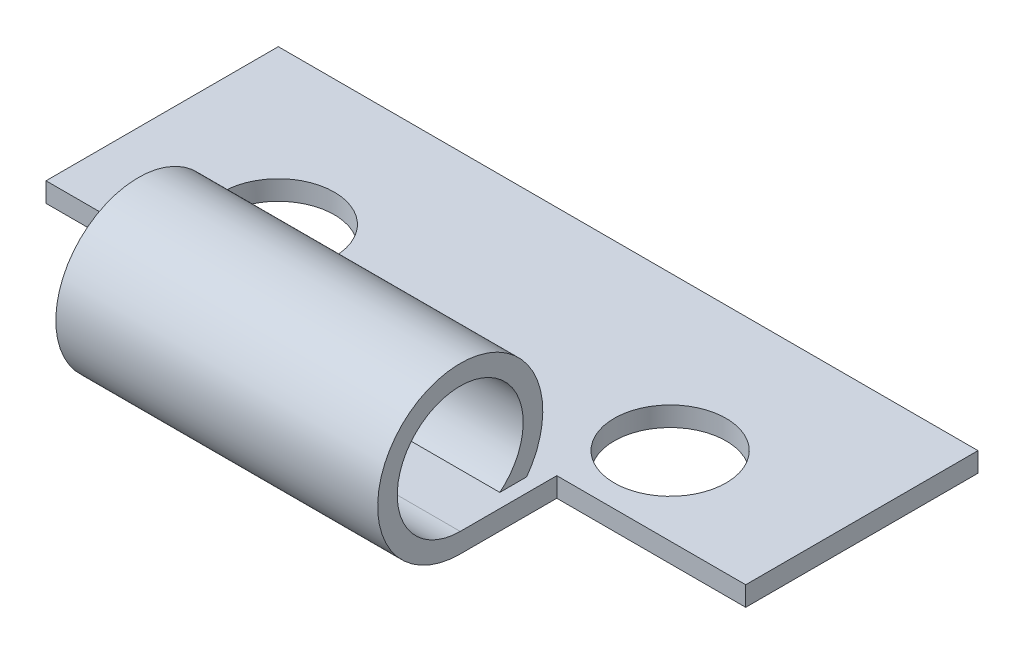
ISO-10303-21;
HEADER;
FILE_DESCRIPTION(('STEP AP214'),'2;1');
FILE_NAME('part.step','',(''),(''),'','','');
FILE_SCHEMA(('AUTOMOTIVE_DESIGN { 1 0 10303 214 1 1 1 1 }'));
ENDSEC;
DATA;
#1=APPLICATION_CONTEXT('core data for automotive mechanical design processes');
#2=APPLICATION_PROTOCOL_DEFINITION('international standard','automotive_design',2000,#1);
#3=PRODUCT_CONTEXT('',#1,'mechanical');
#4=PRODUCT('Part','Part','',(#3));
#5=PRODUCT_RELATED_PRODUCT_CATEGORY('part','',(#4));
#6=PRODUCT_DEFINITION_FORMATION('','',#4);
#7=PRODUCT_DEFINITION_CONTEXT('part definition',#1,'design');
#8=PRODUCT_DEFINITION('design','',#6,#7);
#9=PRODUCT_DEFINITION_SHAPE('','',#8);
#10=(LENGTH_UNIT() NAMED_UNIT(*) SI_UNIT(.MILLI.,.METRE.));
#11=(NAMED_UNIT(*) PLANE_ANGLE_UNIT() SI_UNIT($,.RADIAN.));
#12=(NAMED_UNIT(*) SI_UNIT($,.STERADIAN.) SOLID_ANGLE_UNIT());
#13=UNCERTAINTY_MEASURE_WITH_UNIT(LENGTH_MEASURE(1.E-05),#10,'distance_accuracy_value','');
#14=(GEOMETRIC_REPRESENTATION_CONTEXT(3) GLOBAL_UNCERTAINTY_ASSIGNED_CONTEXT((#13)) GLOBAL_UNIT_ASSIGNED_CONTEXT((#10,
#11,#12)) REPRESENTATION_CONTEXT('',''));
#15=CARTESIAN_POINT('',(0.,0.,0.));
#16=DIRECTION('',(0.,0.,1.));
#17=DIRECTION('',(1.,0.,0.));
#18=AXIS2_PLACEMENT_3D('',#15,#16,#17);
#19=CARTESIAN_POINT('',(12.5,0.,-2.25));
#20=DIRECTION('',(0.,1.,0.));
#21=DIRECTION('',(0.,0.,1.));
#22=AXIS2_PLACEMENT_3D('',#19,#20,#21);
#23=PLANE('',#22);
#24=CARTESIAN_POINT('',(7.,0.,-8.5));
#25=DIRECTION('',(0.,1.,0.));
#26=DIRECTION('',(0.,0.,1.));
#27=AXIS2_PLACEMENT_3D('',#24,#25,#26);
#28=CIRCLE('',#27,2.);
#29=CARTESIAN_POINT('',(7.,0.,-6.5));
#30=VERTEX_POINT('',#29);
#31=EDGE_CURVE('E164',#30,#30,#28,.F.);
#32=ORIENTED_EDGE('',*,*,#31,.F.);
#33=EDGE_LOOP('',(#32));
#34=FACE_BOUND('',#33,.T.);
#35=CARTESIAN_POINT('',(-7.,0.,-8.5));
#36=DIRECTION('',(0.,1.,0.));
#37=DIRECTION('',(0.,0.,1.));
#38=AXIS2_PLACEMENT_3D('',#35,#36,#37);
#39=CIRCLE('',#38,2.);
#40=CARTESIAN_POINT('',(-7.,0.,-6.5));
#41=VERTEX_POINT('',#40);
#42=EDGE_CURVE('E165',#41,#41,#39,.F.);
#43=ORIENTED_EDGE('',*,*,#42,.F.);
#44=EDGE_LOOP('',(#43));
#45=FACE_BOUND('',#44,.T.);
#46=DIRECTION('',(0.,0.,-1.));
#47=VECTOR('',#46,1.);
#48=CARTESIAN_POINT('',(-5.75,0.,-5.7));
#49=LINE('',#48,#47);
#50=CARTESIAN_POINT('',(-5.75,0.,-2.25));
#51=VERTEX_POINT('',#50);
#52=CARTESIAN_POINT('',(-5.75,0.,-5.7));
#53=VERTEX_POINT('',#52);
#54=EDGE_CURVE('E124',#51,#53,#49,.T.);
#55=ORIENTED_EDGE('',*,*,#54,.T.);
#56=DIRECTION('',(-1.,0.,0.));
#57=VECTOR('',#56,1.);
#58=CARTESIAN_POINT('',(-5.75,0.,-5.7));
#59=LINE('',#58,#57);
#60=CARTESIAN_POINT('',(-12.5,0.,-5.7));
#61=VERTEX_POINT('',#60);
#62=EDGE_CURVE('E131',#53,#61,#59,.T.);
#63=ORIENTED_EDGE('',*,*,#62,.T.);
#64=DIRECTION('',(0.,0.,-1.));
#65=VECTOR('',#64,1.);
#66=CARTESIAN_POINT('',(-12.5,0.,-2.25));
#67=LINE('',#66,#65);
#68=CARTESIAN_POINT('',(-12.5,0.,-14.));
#69=VERTEX_POINT('',#68);
#70=EDGE_CURVE('E168',#61,#69,#67,.T.);
#71=ORIENTED_EDGE('',*,*,#70,.T.);
#72=DIRECTION('',(-1.,0.,0.));
#73=VECTOR('',#72,1.);
#74=CARTESIAN_POINT('',(12.5,0.,-14.));
#75=LINE('',#74,#73);
#76=CARTESIAN_POINT('',(12.5,0.,-14.));
#77=VERTEX_POINT('',#76);
#78=EDGE_CURVE('E199',#77,#69,#75,.T.);
#79=ORIENTED_EDGE('',*,*,#78,.F.);
#80=DIRECTION('',(0.,0.,-1.));
#81=VECTOR('',#80,1.);
#82=CARTESIAN_POINT('',(12.5,0.,-2.25));
#83=LINE('',#82,#81);
#84=CARTESIAN_POINT('',(12.5,0.,-5.7));
#85=VERTEX_POINT('',#84);
#86=EDGE_CURVE('E173',#85,#77,#83,.T.);
#87=ORIENTED_EDGE('',*,*,#86,.F.);
#88=DIRECTION('',(-1.,0.,0.));
#89=VECTOR('',#88,1.);
#90=CARTESIAN_POINT('',(14.1936750933291,0.,-5.7));
#91=LINE('',#90,#89);
#92=CARTESIAN_POINT('',(5.75,0.,-5.7));
#93=VERTEX_POINT('',#92);
#94=EDGE_CURVE('E59',#85,#93,#91,.T.);
#95=ORIENTED_EDGE('',*,*,#94,.T.);
#96=DIRECTION('',(0.,0.,1.));
#97=VECTOR('',#96,1.);
#98=CARTESIAN_POINT('',(5.75,0.,-5.7));
#99=LINE('',#98,#97);
#100=CARTESIAN_POINT('',(5.75,0.,-2.25));
#101=VERTEX_POINT('',#100);
#102=EDGE_CURVE('E143',#93,#101,#99,.T.);
#103=ORIENTED_EDGE('',*,*,#102,.T.);
#104=DIRECTION('',(-1.,0.,0.));
#105=VECTOR('',#104,1.);
#106=CARTESIAN_POINT('',(12.5,0.,-2.25));
#107=LINE('',#106,#105);
#108=EDGE_CURVE('E139',#101,#51,#107,.T.);
#109=ORIENTED_EDGE('',*,*,#108,.T.);
#110=EDGE_LOOP('',(#55,#63,#71,#79,#87,#95,#103,#109));
#111=FACE_BOUND('',#110,.T.);
#112=ADVANCED_FACE('F45',(#34,#45,#111),#23,.F.);
#113=CARTESIAN_POINT('',(12.5,0.700000000000002,-14.));
#114=DIRECTION('',(0.,-1.,0.));
#115=DIRECTION('',(0.,0.,-1.));
#116=AXIS2_PLACEMENT_3D('',#113,#114,#115);
#117=PLANE('',#116);
#118=CARTESIAN_POINT('',(7.,0.700000000000001,-8.5));
#119=DIRECTION('',(0.,1.,0.));
#120=DIRECTION('',(0.,0.,1.));
#121=AXIS2_PLACEMENT_3D('',#118,#119,#120);
#122=CIRCLE('',#121,2.);
#123=CARTESIAN_POINT('',(7.,0.700000000000001,-6.5));
#124=VERTEX_POINT('',#123);
#125=EDGE_CURVE('E161',#124,#124,#122,.T.);
#126=ORIENTED_EDGE('',*,*,#125,.F.);
#127=EDGE_LOOP('',(#126));
#128=FACE_BOUND('',#127,.T.);
#129=CARTESIAN_POINT('',(-7.,0.700000000000001,-8.5));
#130=DIRECTION('',(0.,1.,0.));
#131=DIRECTION('',(0.,0.,-1.));
#132=AXIS2_PLACEMENT_3D('',#129,#130,#131);
#133=CIRCLE('',#132,2.);
#134=CARTESIAN_POINT('',(-7.,0.700000000000001,-10.5));
#135=VERTEX_POINT('',#134);
#136=EDGE_CURVE('E160',#135,#135,#133,.T.);
#137=ORIENTED_EDGE('',*,*,#136,.F.);
#138=EDGE_LOOP('',(#137));
#139=FACE_BOUND('',#138,.T.);
#140=DIRECTION('',(0.,0.,-1.));
#141=VECTOR('',#140,1.);
#142=CARTESIAN_POINT('',(-5.75,0.700000000000002,-14.));
#143=LINE('',#142,#141);
#144=CARTESIAN_POINT('',(-5.75,0.7,-2.25));
#145=VERTEX_POINT('',#144);
#146=CARTESIAN_POINT('',(-5.75,0.700000000000001,-5.7));
#147=VERTEX_POINT('',#146);
#148=EDGE_CURVE('E127',#145,#147,#143,.T.);
#149=ORIENTED_EDGE('',*,*,#148,.F.);
#150=DIRECTION('',(-1.,0.,0.));
#151=VECTOR('',#150,1.);
#152=CARTESIAN_POINT('',(12.5,0.7,-2.25));
#153=LINE('',#152,#151);
#154=CARTESIAN_POINT('',(5.75,0.7,-2.25));
#155=VERTEX_POINT('',#154);
#156=EDGE_CURVE('E193',#155,#145,#153,.T.);
#157=ORIENTED_EDGE('',*,*,#156,.F.);
#158=DIRECTION('',(0.,0.,1.));
#159=VECTOR('',#158,1.);
#160=CARTESIAN_POINT('',(5.75,0.700000000000002,-14.));
#161=LINE('',#160,#159);
#162=CARTESIAN_POINT('',(5.75,0.7,-5.7));
#163=VERTEX_POINT('',#162);
#164=EDGE_CURVE('E153',#163,#155,#161,.T.);
#165=ORIENTED_EDGE('',*,*,#164,.F.);
#166=DIRECTION('',(-1.,0.,0.));
#167=VECTOR('',#166,1.);
#168=CARTESIAN_POINT('',(12.5,0.700000000000001,-5.7));
#169=LINE('',#168,#167);
#170=CARTESIAN_POINT('',(12.5,0.700000000000001,-5.7));
#171=VERTEX_POINT('',#170);
#172=EDGE_CURVE('E147',#171,#163,#169,.T.);
#173=ORIENTED_EDGE('',*,*,#172,.F.);
#174=DIRECTION('',(0.,0.,1.));
#175=VECTOR('',#174,1.);
#176=CARTESIAN_POINT('',(12.5,0.700000000000002,-14.));
#177=LINE('',#176,#175);
#178=CARTESIAN_POINT('',(12.5,0.700000000000002,-14.));
#179=VERTEX_POINT('',#178);
#180=EDGE_CURVE('E178',#179,#171,#177,.T.);
#181=ORIENTED_EDGE('',*,*,#180,.F.);
#182=DIRECTION('',(-1.,0.,0.));
#183=VECTOR('',#182,1.);
#184=CARTESIAN_POINT('',(12.5,0.700000000000002,-14.));
#185=LINE('',#184,#183);
#186=CARTESIAN_POINT('',(-12.5,0.700000000000002,-14.));
#187=VERTEX_POINT('',#186);
#188=EDGE_CURVE('E196',#179,#187,#185,.T.);
#189=ORIENTED_EDGE('',*,*,#188,.T.);
#190=DIRECTION('',(0.,0.,1.));
#191=VECTOR('',#190,1.);
#192=CARTESIAN_POINT('',(-12.5,0.700000000000002,-14.));
#193=LINE('',#192,#191);
#194=CARTESIAN_POINT('',(-12.5,0.700000000000001,-5.7));
#195=VERTEX_POINT('',#194);
#196=EDGE_CURVE('E176',#187,#195,#193,.T.);
#197=ORIENTED_EDGE('',*,*,#196,.T.);
#198=DIRECTION('',(-1.,0.,0.));
#199=VECTOR('',#198,1.);
#200=CARTESIAN_POINT('',(12.5,0.700000000000001,-5.7));
#201=LINE('',#200,#199);
#202=EDGE_CURVE('E67',#147,#195,#201,.T.);
#203=ORIENTED_EDGE('',*,*,#202,.F.);
#204=EDGE_LOOP('',(#149,#157,#165,#173,#181,#189,#197,#203));
#205=FACE_BOUND('',#204,.T.);
#206=ADVANCED_FACE('F231',(#128,#139,#205),#117,.F.);
#207=CARTESIAN_POINT('',(12.5,2.95,-2.25));
#208=DIRECTION('',(-1.,0.,0.));
#209=DIRECTION('',(0.,0.,1.));
#210=AXIS2_PLACEMENT_3D('',#207,#208,#209);
#211=CYLINDRICAL_SURFACE('',#210,2.25);
#212=CARTESIAN_POINT('',(-5.75,2.95,-2.25));
#213=DIRECTION('',(-1.,0.,0.));
#214=DIRECTION('',(0.,0.,1.));
#215=AXIS2_PLACEMENT_3D('',#212,#213,#214);
#216=CIRCLE('',#215,2.25);
#217=CARTESIAN_POINT('',(-5.75,1.2,-3.66421356237309));
#218=VERTEX_POINT('',#217);
#219=EDGE_CURVE('E157',#218,#145,#216,.F.);
#220=ORIENTED_EDGE('',*,*,#219,.F.);
#221=DIRECTION('',(-1.,0.,0.));
#222=VECTOR('',#221,1.);
#223=CARTESIAN_POINT('',(12.5,1.2,-3.66421356237309));
#224=LINE('',#223,#222);
#225=CARTESIAN_POINT('',(5.75,1.2,-3.66421356237309));
#226=VERTEX_POINT('',#225);
#227=EDGE_CURVE('E190',#226,#218,#224,.T.);
#228=ORIENTED_EDGE('',*,*,#227,.F.);
#229=CARTESIAN_POINT('',(5.75,2.95,-2.25));
#230=DIRECTION('',(1.,0.,0.));
#231=DIRECTION('',(0.,0.,-1.));
#232=AXIS2_PLACEMENT_3D('',#229,#230,#231);
#233=CIRCLE('',#232,2.25);
#234=EDGE_CURVE('E151',#155,#226,#233,.F.);
#235=ORIENTED_EDGE('',*,*,#234,.F.);
#236=ORIENTED_EDGE('',*,*,#156,.T.);
#237=EDGE_LOOP('',(#220,#228,#235,#236));
#238=FACE_BOUND('',#237,.T.);
#239=ADVANCED_FACE('F237',(#238),#211,.F.);
#240=CARTESIAN_POINT('',(12.5,1.2,-4.62486841740758));
#241=DIRECTION('',(0.,1.,0.));
#242=DIRECTION('',(0.,0.,1.));
#243=AXIS2_PLACEMENT_3D('',#240,#241,#242);
#244=PLANE('',#243);
#245=DIRECTION('',(0.,0.,1.));
#246=VECTOR('',#245,1.);
#247=CARTESIAN_POINT('',(-5.75,1.2,-4.62486841740758));
#248=LINE('',#247,#246);
#249=CARTESIAN_POINT('',(-5.75,1.2,-4.62486841740758));
#250=VERTEX_POINT('',#249);
#251=EDGE_CURVE('E155',#250,#218,#248,.T.);
#252=ORIENTED_EDGE('',*,*,#251,.F.);
#253=DIRECTION('',(-1.,0.,0.));
#254=VECTOR('',#253,1.);
#255=CARTESIAN_POINT('',(12.5,1.2,-4.62486841740758));
#256=LINE('',#255,#254);
#257=CARTESIAN_POINT('',(5.75,1.2,-4.62486841740758));
#258=VERTEX_POINT('',#257);
#259=EDGE_CURVE('E187',#258,#250,#256,.T.);
#260=ORIENTED_EDGE('',*,*,#259,.F.);
#261=DIRECTION('',(0.,0.,-1.));
#262=VECTOR('',#261,1.);
#263=CARTESIAN_POINT('',(5.75,1.2,-4.62486841740758));
#264=LINE('',#263,#262);
#265=EDGE_CURVE('E149',#226,#258,#264,.T.);
#266=ORIENTED_EDGE('',*,*,#265,.F.);
#267=ORIENTED_EDGE('',*,*,#227,.T.);
#268=EDGE_LOOP('',(#252,#260,#266,#267));
#269=FACE_BOUND('',#268,.T.);
#270=ADVANCED_FACE('F209',(#269),#244,.F.);
#271=CARTESIAN_POINT('',(12.5,2.95,-2.25));
#272=DIRECTION('',(-1.,0.,0.));
#273=DIRECTION('',(0.,0.,1.));
#274=AXIS2_PLACEMENT_3D('',#271,#272,#273);
#275=CYLINDRICAL_SURFACE('',#274,2.95);
#276=CARTESIAN_POINT('',(-5.75,2.95,-2.25));
#277=DIRECTION('',(-1.,0.,0.));
#278=DIRECTION('',(0.,0.,1.));
#279=AXIS2_PLACEMENT_3D('',#276,#277,#278);
#280=CIRCLE('',#279,2.95);
#281=EDGE_CURVE('E52',#51,#250,#280,.T.);
#282=ORIENTED_EDGE('',*,*,#281,.F.);
#283=ORIENTED_EDGE('',*,*,#108,.F.);
#284=CARTESIAN_POINT('',(5.75,2.95,-2.25));
#285=DIRECTION('',(1.,0.,0.));
#286=DIRECTION('',(0.,0.,-1.));
#287=AXIS2_PLACEMENT_3D('',#284,#285,#286);
#288=CIRCLE('',#287,2.95);
#289=EDGE_CURVE('E11',#258,#101,#288,.T.);
#290=ORIENTED_EDGE('',*,*,#289,.F.);
#291=ORIENTED_EDGE('',*,*,#259,.T.);
#292=EDGE_LOOP('',(#282,#283,#290,#291));
#293=FACE_BOUND('',#292,.T.);
#294=ADVANCED_FACE('F213',(#293),#275,.T.);
#295=CARTESIAN_POINT('',(12.5,2.95,-2.25));
#296=DIRECTION('',(1.,0.,0.));
#297=DIRECTION('',(0.,0.,-1.));
#298=AXIS2_PLACEMENT_3D('',#295,#296,#297);
#299=PLANE('',#298);
#300=ORIENTED_EDGE('',*,*,#180,.T.);
#301=DIRECTION('',(0.,-1.,0.));
#302=VECTOR('',#301,1.);
#303=CARTESIAN_POINT('',(12.5,2.95,-5.7));
#304=LINE('',#303,#302);
#305=EDGE_CURVE('E203',#171,#85,#304,.T.);
#306=ORIENTED_EDGE('',*,*,#305,.T.);
#307=ORIENTED_EDGE('',*,*,#86,.T.);
#308=DIRECTION('',(0.,1.,0.));
#309=VECTOR('',#308,1.);
#310=CARTESIAN_POINT('',(12.5,0.,-14.));
#311=LINE('',#310,#309);
#312=EDGE_CURVE('E175',#77,#179,#311,.T.);
#313=ORIENTED_EDGE('',*,*,#312,.T.);
#314=EDGE_LOOP('',(#300,#306,#307,#313));
#315=FACE_BOUND('',#314,.T.);
#316=ADVANCED_FACE('F222',(#315),#299,.T.);
#317=CARTESIAN_POINT('',(-12.5,2.95,-2.25));
#318=DIRECTION('',(1.,0.,0.));
#319=DIRECTION('',(0.,0.,-1.));
#320=AXIS2_PLACEMENT_3D('',#317,#318,#319);
#321=PLANE('',#320);
#322=DIRECTION('',(0.,-1.,0.));
#323=VECTOR('',#322,1.);
#324=CARTESIAN_POINT('',(-12.5,2.95,-5.7));
#325=LINE('',#324,#323);
#326=EDGE_CURVE('E133',#195,#61,#325,.T.);
#327=ORIENTED_EDGE('',*,*,#326,.F.);
#328=ORIENTED_EDGE('',*,*,#196,.F.);
#329=DIRECTION('',(0.,1.,0.));
#330=VECTOR('',#329,1.);
#331=CARTESIAN_POINT('',(-12.5,0.,-14.));
#332=LINE('',#331,#330);
#333=EDGE_CURVE('E182',#69,#187,#332,.T.);
#334=ORIENTED_EDGE('',*,*,#333,.F.);
#335=ORIENTED_EDGE('',*,*,#70,.F.);
#336=EDGE_LOOP('',(#327,#328,#334,#335));
#337=FACE_BOUND('',#336,.T.);
#338=ADVANCED_FACE('F239',(#337),#321,.F.);
#339=CARTESIAN_POINT('',(12.5,0.,-14.));
#340=DIRECTION('',(0.,0.,1.));
#341=DIRECTION('',(1.,0.,0.));
#342=AXIS2_PLACEMENT_3D('',#339,#340,#341);
#343=PLANE('',#342);
#344=ORIENTED_EDGE('',*,*,#333,.T.);
#345=ORIENTED_EDGE('',*,*,#188,.F.);
#346=ORIENTED_EDGE('',*,*,#312,.F.);
#347=ORIENTED_EDGE('',*,*,#78,.T.);
#348=EDGE_LOOP('',(#344,#345,#346,#347));
#349=FACE_BOUND('',#348,.T.);
#350=ADVANCED_FACE('F225',(#349),#343,.F.);
#351=CARTESIAN_POINT('',(-7.,-0.00100000000000078,-8.5));
#352=DIRECTION('',(0.,1.,0.));
#353=DIRECTION('',(0.,0.,1.));
#354=AXIS2_PLACEMENT_3D('',#351,#352,#353);
#355=CYLINDRICAL_SURFACE('',#354,2.);
#356=ORIENTED_EDGE('',*,*,#136,.T.);
#357=EDGE_LOOP('',(#356));
#358=FACE_BOUND('',#357,.T.);
#359=ORIENTED_EDGE('',*,*,#42,.T.);
#360=EDGE_LOOP('',(#359));
#361=FACE_BOUND('',#360,.T.);
#362=ADVANCED_FACE('F247',(#358,#361),#355,.F.);
#363=CARTESIAN_POINT('',(7.,-0.00100000000000078,-8.5));
#364=DIRECTION('',(0.,1.,0.));
#365=DIRECTION('',(0.,0.,1.));
#366=AXIS2_PLACEMENT_3D('',#363,#364,#365);
#367=CYLINDRICAL_SURFACE('',#366,2.);
#368=ORIENTED_EDGE('',*,*,#125,.T.);
#369=EDGE_LOOP('',(#368));
#370=FACE_BOUND('',#369,.T.);
#371=ORIENTED_EDGE('',*,*,#31,.T.);
#372=EDGE_LOOP('',(#371));
#373=FACE_BOUND('',#372,.T.);
#374=ADVANCED_FACE('F263',(#370,#373),#367,.F.);
#375=CARTESIAN_POINT('',(-5.75,5.9,-5.7));
#376=DIRECTION('',(0.,0.,1.));
#377=DIRECTION('',(0.,-1.,0.));
#378=AXIS2_PLACEMENT_3D('',#375,#376,#377);
#379=PLANE('',#378);
#380=ORIENTED_EDGE('',*,*,#202,.T.);
#381=ORIENTED_EDGE('',*,*,#326,.T.);
#382=ORIENTED_EDGE('',*,*,#62,.F.);
#383=DIRECTION('',(0.,-1.,0.));
#384=VECTOR('',#383,1.);
#385=CARTESIAN_POINT('',(-5.75,5.9,-5.7));
#386=LINE('',#385,#384);
#387=EDGE_CURVE('E120',#147,#53,#386,.T.);
#388=ORIENTED_EDGE('',*,*,#387,.F.);
#389=EDGE_LOOP('',(#380,#381,#382,#388));
#390=FACE_BOUND('',#389,.T.);
#391=ADVANCED_FACE('F132',(#390),#379,.T.);
#392=CARTESIAN_POINT('',(-5.75,5.9,-5.7));
#393=DIRECTION('',(-1.,0.,0.));
#394=DIRECTION('',(0.,0.,1.));
#395=AXIS2_PLACEMENT_3D('',#392,#393,#394);
#396=PLANE('',#395);
#397=ORIENTED_EDGE('',*,*,#148,.T.);
#398=ORIENTED_EDGE('',*,*,#387,.T.);
#399=ORIENTED_EDGE('',*,*,#54,.F.);
#400=ORIENTED_EDGE('',*,*,#281,.T.);
#401=ORIENTED_EDGE('',*,*,#251,.T.);
#402=ORIENTED_EDGE('',*,*,#219,.T.);
#403=EDGE_LOOP('',(#397,#398,#399,#400,#401,#402));
#404=FACE_BOUND('',#403,.T.);
#405=ADVANCED_FACE('F122',(#404),#396,.T.);
#406=CARTESIAN_POINT('',(5.75,5.9,-5.7));
#407=DIRECTION('',(1.,0.,0.));
#408=DIRECTION('',(0.,0.,-1.));
#409=AXIS2_PLACEMENT_3D('',#406,#407,#408);
#410=PLANE('',#409);
#411=ORIENTED_EDGE('',*,*,#289,.T.);
#412=ORIENTED_EDGE('',*,*,#102,.F.);
#413=DIRECTION('',(0.,-1.,0.));
#414=VECTOR('',#413,1.);
#415=CARTESIAN_POINT('',(5.75,5.9,-5.7));
#416=LINE('',#415,#414);
#417=EDGE_CURVE('E128',#163,#93,#416,.T.);
#418=ORIENTED_EDGE('',*,*,#417,.F.);
#419=ORIENTED_EDGE('',*,*,#164,.T.);
#420=ORIENTED_EDGE('',*,*,#234,.T.);
#421=ORIENTED_EDGE('',*,*,#265,.T.);
#422=EDGE_LOOP('',(#411,#412,#418,#419,#420,#421));
#423=FACE_BOUND('',#422,.T.);
#424=ADVANCED_FACE('F216',(#423),#410,.T.);
#425=CARTESIAN_POINT('',(14.1936750933291,5.9,-5.7));
#426=DIRECTION('',(0.,0.,1.));
#427=DIRECTION('',(0.,-1.,0.));
#428=AXIS2_PLACEMENT_3D('',#425,#426,#427);
#429=PLANE('',#428);
#430=ORIENTED_EDGE('',*,*,#172,.T.);
#431=ORIENTED_EDGE('',*,*,#417,.T.);
#432=ORIENTED_EDGE('',*,*,#94,.F.);
#433=ORIENTED_EDGE('',*,*,#305,.F.);
#434=EDGE_LOOP('',(#430,#431,#432,#433));
#435=FACE_BOUND('',#434,.T.);
#436=ADVANCED_FACE('F234',(#435),#429,.T.);
#437=CLOSED_SHELL('',(#112,#206,#239,#270,#294,#316,#338,#350,#362,#374,#391,#405,#424,#436));
#438=MANIFOLD_SOLID_BREP('B2',#437);
#439=ADVANCED_BREP_SHAPE_REPRESENTATION('',(#18,#438),#14);
#440=SHAPE_DEFINITION_REPRESENTATION(#9,#439);
ENDSEC;
END-ISO-10303-21;
